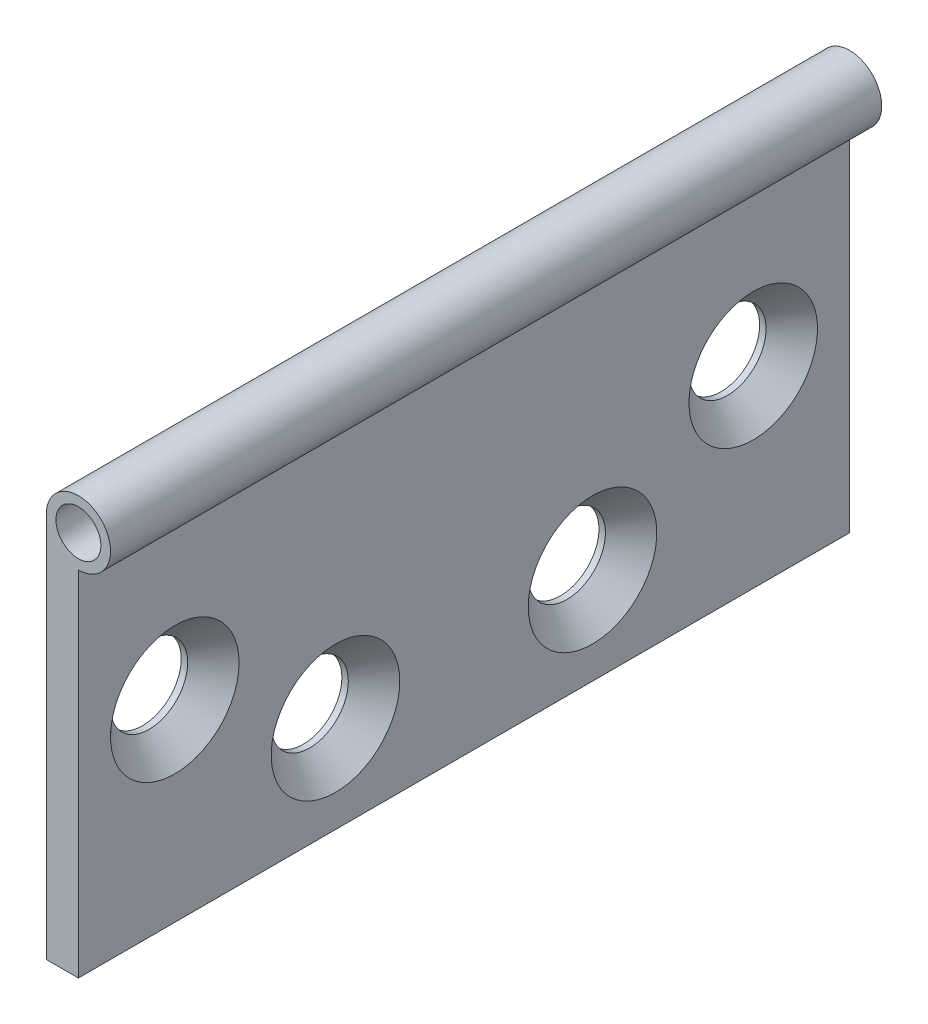
ISO-10303-21;
HEADER;
FILE_DESCRIPTION(('STEP AP214'),'2;1');
FILE_NAME('part.step','',(''),(''),'','','');
FILE_SCHEMA(('AUTOMOTIVE_DESIGN { 1 0 10303 214 1 1 1 1 }'));
ENDSEC;
DATA;
#1=APPLICATION_CONTEXT('core data for automotive mechanical design processes');
#2=APPLICATION_PROTOCOL_DEFINITION('international standard','automotive_design',2000,#1);
#3=PRODUCT_CONTEXT('',#1,'mechanical');
#4=PRODUCT('Part','Part','',(#3));
#5=PRODUCT_RELATED_PRODUCT_CATEGORY('part','',(#4));
#6=PRODUCT_DEFINITION_FORMATION('','',#4);
#7=PRODUCT_DEFINITION_CONTEXT('part definition',#1,'design');
#8=PRODUCT_DEFINITION('design','',#6,#7);
#9=PRODUCT_DEFINITION_SHAPE('','',#8);
#10=(LENGTH_UNIT() NAMED_UNIT(*) SI_UNIT(.MILLI.,.METRE.));
#11=(NAMED_UNIT(*) PLANE_ANGLE_UNIT() SI_UNIT($,.RADIAN.));
#12=(NAMED_UNIT(*) SI_UNIT($,.STERADIAN.) SOLID_ANGLE_UNIT());
#13=UNCERTAINTY_MEASURE_WITH_UNIT(LENGTH_MEASURE(1.E-05),#10,'distance_accuracy_value','');
#14=(GEOMETRIC_REPRESENTATION_CONTEXT(3) GLOBAL_UNCERTAINTY_ASSIGNED_CONTEXT((#13)) GLOBAL_UNIT_ASSIGNED_CONTEXT((#10,
#11,#12)) REPRESENTATION_CONTEXT('',''));
#15=CARTESIAN_POINT('',(0.,0.,0.));
#16=DIRECTION('',(0.,0.,1.));
#17=DIRECTION('',(1.,0.,0.));
#18=AXIS2_PLACEMENT_3D('',#15,#16,#17);
#19=CARTESIAN_POINT('',(5.,0.,60.));
#20=DIRECTION('',(-1.,0.,0.));
#21=DIRECTION('',(0.,0.,1.));
#22=AXIS2_PLACEMENT_3D('',#19,#20,#21);
#23=PLANE('',#22);
#24=CARTESIAN_POINT('',(5.,15.,-20.));
#25=DIRECTION('',(-1.,0.,0.));
#26=DIRECTION('',(0.,0.,1.));
#27=AXIS2_PLACEMENT_3D('',#24,#25,#26);
#28=CIRCLE('',#27,10.);
#29=CARTESIAN_POINT('',(5.,15.,-9.99999999999999));
#30=VERTEX_POINT('',#29);
#31=EDGE_CURVE('E127',#30,#30,#28,.T.);
#32=ORIENTED_EDGE('',*,*,#31,.T.);
#33=EDGE_LOOP('',(#32));
#34=FACE_BOUND('',#33,.T.);
#35=CARTESIAN_POINT('',(5.,30.,-45.));
#36=DIRECTION('',(-1.,0.,0.));
#37=DIRECTION('',(0.,0.,1.));
#38=AXIS2_PLACEMENT_3D('',#35,#36,#37);
#39=CIRCLE('',#38,10.);
#40=CARTESIAN_POINT('',(5.,30.,-35.));
#41=VERTEX_POINT('',#40);
#42=EDGE_CURVE('E131',#41,#41,#39,.T.);
#43=ORIENTED_EDGE('',*,*,#42,.T.);
#44=EDGE_LOOP('',(#43));
#45=FACE_BOUND('',#44,.T.);
#46=CARTESIAN_POINT('',(5.,30.,45.));
#47=DIRECTION('',(1.,0.,0.));
#48=DIRECTION('',(0.,0.,-1.));
#49=AXIS2_PLACEMENT_3D('',#46,#47,#48);
#50=CIRCLE('',#49,10.);
#51=CARTESIAN_POINT('',(5.,30.,35.));
#52=VERTEX_POINT('',#51);
#53=EDGE_CURVE('E135',#52,#52,#50,.T.);
#54=ORIENTED_EDGE('',*,*,#53,.F.);
#55=EDGE_LOOP('',(#54));
#56=FACE_BOUND('',#55,.T.);
#57=CARTESIAN_POINT('',(5.,15.,20.));
#58=DIRECTION('',(1.,0.,0.));
#59=DIRECTION('',(0.,0.,-1.));
#60=AXIS2_PLACEMENT_3D('',#57,#58,#59);
#61=CIRCLE('',#60,10.);
#62=CARTESIAN_POINT('',(5.,15.,9.99999999999999));
#63=VERTEX_POINT('',#62);
#64=EDGE_CURVE('E138',#63,#63,#61,.T.);
#65=ORIENTED_EDGE('',*,*,#64,.F.);
#66=EDGE_LOOP('',(#65));
#67=FACE_BOUND('',#66,.T.);
#68=DIRECTION('',(0.,0.,-1.));
#69=VECTOR('',#68,1.);
#70=CARTESIAN_POINT('',(5.,55.,60.));
#71=LINE('',#70,#69);
#72=CARTESIAN_POINT('',(5.,55.,60.));
#73=VERTEX_POINT('',#72);
#74=CARTESIAN_POINT('',(5.,55.,-60.));
#75=VERTEX_POINT('',#74);
#76=EDGE_CURVE('E51',#73,#75,#71,.T.);
#77=ORIENTED_EDGE('',*,*,#76,.F.);
#78=DIRECTION('',(0.,1.,0.));
#79=VECTOR('',#78,1.);
#80=CARTESIAN_POINT('',(5.,0.,60.));
#81=LINE('',#80,#79);
#82=CARTESIAN_POINT('',(5.,0.,60.));
#83=VERTEX_POINT('',#82);
#84=EDGE_CURVE('E106',#83,#73,#81,.T.);
#85=ORIENTED_EDGE('',*,*,#84,.F.);
#86=DIRECTION('',(0.,0.,-1.));
#87=VECTOR('',#86,1.);
#88=CARTESIAN_POINT('',(5.,0.,60.));
#89=LINE('',#88,#87);
#90=CARTESIAN_POINT('',(5.,0.,-60.));
#91=VERTEX_POINT('',#90);
#92=EDGE_CURVE('E60',#83,#91,#89,.T.);
#93=ORIENTED_EDGE('',*,*,#92,.T.);
#94=DIRECTION('',(0.,1.,0.));
#95=VECTOR('',#94,1.);
#96=CARTESIAN_POINT('',(5.,0.,-60.));
#97=LINE('',#96,#95);
#98=EDGE_CURVE('E101',#91,#75,#97,.T.);
#99=ORIENTED_EDGE('',*,*,#98,.T.);
#100=EDGE_LOOP('',(#77,#85,#93,#99));
#101=FACE_BOUND('',#100,.T.);
#102=ADVANCED_FACE('F37',(#34,#45,#56,#67,#101),#23,.F.);
#103=CARTESIAN_POINT('',(0.,0.,60.));
#104=DIRECTION('',(-1.,0.,0.));
#105=DIRECTION('',(0.,0.,1.));
#106=AXIS2_PLACEMENT_3D('',#103,#104,#105);
#107=PLANE('',#106);
#108=CARTESIAN_POINT('',(0.,15.,-20.));
#109=DIRECTION('',(-1.,0.,0.));
#110=DIRECTION('',(0.,0.,1.));
#111=AXIS2_PLACEMENT_3D('',#108,#109,#110);
#112=CIRCLE('',#111,6.);
#113=CARTESIAN_POINT('',(0.,15.,-14.));
#114=VERTEX_POINT('',#113);
#115=EDGE_CURVE('E218',#114,#114,#112,.T.);
#116=ORIENTED_EDGE('',*,*,#115,.F.);
#117=EDGE_LOOP('',(#116));
#118=FACE_BOUND('',#117,.T.);
#119=CARTESIAN_POINT('',(0.,30.,-45.));
#120=DIRECTION('',(-1.,0.,0.));
#121=DIRECTION('',(0.,0.,1.));
#122=AXIS2_PLACEMENT_3D('',#119,#120,#121);
#123=CIRCLE('',#122,6.);
#124=CARTESIAN_POINT('',(0.,30.,-39.));
#125=VERTEX_POINT('',#124);
#126=EDGE_CURVE('E225',#125,#125,#123,.T.);
#127=ORIENTED_EDGE('',*,*,#126,.F.);
#128=EDGE_LOOP('',(#127));
#129=FACE_BOUND('',#128,.T.);
#130=CARTESIAN_POINT('',(0.,30.,45.));
#131=DIRECTION('',(1.,0.,0.));
#132=DIRECTION('',(0.,0.,-1.));
#133=AXIS2_PLACEMENT_3D('',#130,#131,#132);
#134=CIRCLE('',#133,6.);
#135=CARTESIAN_POINT('',(0.,30.,39.));
#136=VERTEX_POINT('',#135);
#137=EDGE_CURVE('E141',#136,#136,#134,.T.);
#138=ORIENTED_EDGE('',*,*,#137,.T.);
#139=EDGE_LOOP('',(#138));
#140=FACE_BOUND('',#139,.T.);
#141=CARTESIAN_POINT('',(0.,15.,20.));
#142=DIRECTION('',(1.,0.,0.));
#143=DIRECTION('',(0.,0.,-1.));
#144=AXIS2_PLACEMENT_3D('',#141,#142,#143);
#145=CIRCLE('',#144,6.);
#146=CARTESIAN_POINT('',(0.,15.,14.));
#147=VERTEX_POINT('',#146);
#148=EDGE_CURVE('E144',#147,#147,#145,.T.);
#149=ORIENTED_EDGE('',*,*,#148,.T.);
#150=EDGE_LOOP('',(#149));
#151=FACE_BOUND('',#150,.T.);
#152=DIRECTION('',(0.,1.,0.));
#153=VECTOR('',#152,1.);
#154=CARTESIAN_POINT('',(0.,0.,-60.));
#155=LINE('',#154,#153);
#156=CARTESIAN_POINT('',(0.,0.,-60.));
#157=VERTEX_POINT('',#156);
#158=CARTESIAN_POINT('',(0.,60.,-60.));
#159=VERTEX_POINT('',#158);
#160=EDGE_CURVE('E100',#157,#159,#155,.T.);
#161=ORIENTED_EDGE('',*,*,#160,.F.);
#162=DIRECTION('',(0.,0.,-1.));
#163=VECTOR('',#162,1.);
#164=CARTESIAN_POINT('',(0.,0.,60.));
#165=LINE('',#164,#163);
#166=CARTESIAN_POINT('',(0.,0.,60.));
#167=VERTEX_POINT('',#166);
#168=EDGE_CURVE('E44',#167,#157,#165,.T.);
#169=ORIENTED_EDGE('',*,*,#168,.F.);
#170=DIRECTION('',(0.,1.,0.));
#171=VECTOR('',#170,1.);
#172=CARTESIAN_POINT('',(0.,0.,60.));
#173=LINE('',#172,#171);
#174=CARTESIAN_POINT('',(0.,60.,60.));
#175=VERTEX_POINT('',#174);
#176=EDGE_CURVE('E76',#167,#175,#173,.T.);
#177=ORIENTED_EDGE('',*,*,#176,.T.);
#178=DIRECTION('',(0.,0.,-1.));
#179=VECTOR('',#178,1.);
#180=CARTESIAN_POINT('',(0.,60.,60.));
#181=LINE('',#180,#179);
#182=EDGE_CURVE('E11',#175,#159,#181,.T.);
#183=ORIENTED_EDGE('',*,*,#182,.T.);
#184=EDGE_LOOP('',(#161,#169,#177,#183));
#185=FACE_BOUND('',#184,.T.);
#186=ADVANCED_FACE('F117',(#118,#129,#140,#151,#185),#107,.T.);
#187=CARTESIAN_POINT('',(5.,0.,60.));
#188=DIRECTION('',(0.,-1.,0.));
#189=DIRECTION('',(0.,0.,-1.));
#190=AXIS2_PLACEMENT_3D('',#187,#188,#189);
#191=PLANE('',#190);
#192=DIRECTION('',(-1.,0.,0.));
#193=VECTOR('',#192,1.);
#194=CARTESIAN_POINT('',(5.,0.,-60.));
#195=LINE('',#194,#193);
#196=EDGE_CURVE('E108',#91,#157,#195,.T.);
#197=ORIENTED_EDGE('',*,*,#196,.F.);
#198=ORIENTED_EDGE('',*,*,#92,.F.);
#199=DIRECTION('',(-1.,0.,0.));
#200=VECTOR('',#199,1.);
#201=CARTESIAN_POINT('',(5.,0.,60.));
#202=LINE('',#201,#200);
#203=EDGE_CURVE('E110',#83,#167,#202,.T.);
#204=ORIENTED_EDGE('',*,*,#203,.T.);
#205=ORIENTED_EDGE('',*,*,#168,.T.);
#206=EDGE_LOOP('',(#197,#198,#204,#205));
#207=FACE_BOUND('',#206,.T.);
#208=ADVANCED_FACE('F115',(#207),#191,.T.);
#209=CARTESIAN_POINT('',(0.,0.,60.));
#210=DIRECTION('',(0.,0.,-1.));
#211=DIRECTION('',(-1.,0.,0.));
#212=AXIS2_PLACEMENT_3D('',#209,#210,#211);
#213=PLANE('',#212);
#214=CARTESIAN_POINT('',(5.,60.,60.));
#215=DIRECTION('',(0.,0.,1.));
#216=DIRECTION('',(1.,0.,0.));
#217=AXIS2_PLACEMENT_3D('',#214,#215,#216);
#218=CIRCLE('',#217,3.5);
#219=CARTESIAN_POINT('',(8.5,60.,60.));
#220=VERTEX_POINT('',#219);
#221=EDGE_CURVE('E153',#220,#220,#218,.T.);
#222=ORIENTED_EDGE('',*,*,#221,.F.);
#223=EDGE_LOOP('',(#222));
#224=FACE_BOUND('',#223,.T.);
#225=ORIENTED_EDGE('',*,*,#84,.T.);
#226=CARTESIAN_POINT('',(5.,60.,60.));
#227=DIRECTION('',(0.,0.,1.));
#228=DIRECTION('',(1.,0.,0.));
#229=AXIS2_PLACEMENT_3D('',#226,#227,#228);
#230=CIRCLE('',#229,5.);
#231=CARTESIAN_POINT('',(10.,60.,60.));
#232=VERTEX_POINT('',#231);
#233=EDGE_CURVE('E156',#73,#232,#230,.T.);
#234=ORIENTED_EDGE('',*,*,#233,.T.);
#235=EDGE_CURVE('E94',#232,#175,#230,.T.);
#236=ORIENTED_EDGE('',*,*,#235,.T.);
#237=ORIENTED_EDGE('',*,*,#176,.F.);
#238=ORIENTED_EDGE('',*,*,#203,.F.);
#239=EDGE_LOOP('',(#225,#234,#236,#237,#238));
#240=FACE_BOUND('',#239,.T.);
#241=ADVANCED_FACE('F162',(#224,#240),#213,.F.);
#242=CARTESIAN_POINT('',(0.,0.,-60.));
#243=DIRECTION('',(0.,0.,-1.));
#244=DIRECTION('',(-1.,0.,0.));
#245=AXIS2_PLACEMENT_3D('',#242,#243,#244);
#246=PLANE('',#245);
#247=CARTESIAN_POINT('',(5.,60.,-60.));
#248=DIRECTION('',(0.,0.,1.));
#249=DIRECTION('',(1.,0.,0.));
#250=AXIS2_PLACEMENT_3D('',#247,#248,#249);
#251=CIRCLE('',#250,3.5);
#252=CARTESIAN_POINT('',(8.5,60.,-60.));
#253=VERTEX_POINT('',#252);
#254=EDGE_CURVE('E154',#253,#253,#251,.T.);
#255=ORIENTED_EDGE('',*,*,#254,.T.);
#256=EDGE_LOOP('',(#255));
#257=FACE_BOUND('',#256,.T.);
#258=ORIENTED_EDGE('',*,*,#160,.T.);
#259=CARTESIAN_POINT('',(5.,60.,-60.));
#260=DIRECTION('',(0.,0.,1.));
#261=DIRECTION('',(1.,0.,0.));
#262=AXIS2_PLACEMENT_3D('',#259,#260,#261);
#263=CIRCLE('',#262,5.);
#264=CARTESIAN_POINT('',(10.,60.,-60.));
#265=VERTEX_POINT('',#264);
#266=EDGE_CURVE('E91',#265,#159,#263,.T.);
#267=ORIENTED_EDGE('',*,*,#266,.F.);
#268=EDGE_CURVE('E88',#75,#265,#263,.T.);
#269=ORIENTED_EDGE('',*,*,#268,.F.);
#270=ORIENTED_EDGE('',*,*,#98,.F.);
#271=ORIENTED_EDGE('',*,*,#196,.T.);
#272=EDGE_LOOP('',(#258,#267,#269,#270,#271));
#273=FACE_BOUND('',#272,.T.);
#274=ADVANCED_FACE('F97',(#257,#273),#246,.T.);
#275=CARTESIAN_POINT('',(5.,60.,60.));
#276=DIRECTION('',(0.,0.,-1.));
#277=DIRECTION('',(-1.,0.,0.));
#278=AXIS2_PLACEMENT_3D('',#275,#276,#277);
#279=CYLINDRICAL_SURFACE('',#278,5.);
#280=ORIENTED_EDGE('',*,*,#182,.F.);
#281=ORIENTED_EDGE('',*,*,#235,.F.);
#282=ORIENTED_EDGE('',*,*,#233,.F.);
#283=ORIENTED_EDGE('',*,*,#76,.T.);
#284=ORIENTED_EDGE('',*,*,#268,.T.);
#285=ORIENTED_EDGE('',*,*,#266,.T.);
#286=EDGE_LOOP('',(#280,#281,#282,#283,#284,#285));
#287=FACE_BOUND('',#286,.T.);
#288=ADVANCED_FACE('F90',(#287),#279,.T.);
#289=CARTESIAN_POINT('',(5.,60.,-60.));
#290=DIRECTION('',(0.,0.,1.));
#291=DIRECTION('',(1.,0.,0.));
#292=AXIS2_PLACEMENT_3D('',#289,#290,#291);
#293=CYLINDRICAL_SURFACE('',#292,3.5);
#294=ORIENTED_EDGE('',*,*,#254,.F.);
#295=EDGE_LOOP('',(#294));
#296=FACE_BOUND('',#295,.T.);
#297=ORIENTED_EDGE('',*,*,#221,.T.);
#298=EDGE_LOOP('',(#297));
#299=FACE_BOUND('',#298,.T.);
#300=ADVANCED_FACE('F160',(#296,#299),#293,.F.);
#301=CARTESIAN_POINT('',(5.,15.,20.));
#302=DIRECTION('',(1.,0.,0.));
#303=DIRECTION('',(0.,0.,-1.));
#304=AXIS2_PLACEMENT_3D('',#301,#302,#303);
#305=CYLINDRICAL_SURFACE('',#304,6.);
#306=ORIENTED_EDGE('',*,*,#148,.F.);
#307=EDGE_LOOP('',(#306));
#308=FACE_BOUND('',#307,.T.);
#309=CARTESIAN_POINT('',(1.,15.,20.));
#310=DIRECTION('',(1.,0.,0.));
#311=DIRECTION('',(0.,0.,-1.));
#312=AXIS2_PLACEMENT_3D('',#309,#310,#311);
#313=CIRCLE('',#312,6.);
#314=CARTESIAN_POINT('',(1.,15.,14.));
#315=VERTEX_POINT('',#314);
#316=EDGE_CURVE('E140',#315,#315,#313,.T.);
#317=ORIENTED_EDGE('',*,*,#316,.T.);
#318=EDGE_LOOP('',(#317));
#319=FACE_BOUND('',#318,.T.);
#320=ADVANCED_FACE('F180',(#308,#319),#305,.F.);
#321=CARTESIAN_POINT('',(5.,15.,20.));
#322=DIRECTION('',(1.,0.,0.));
#323=DIRECTION('',(0.,0.,-1.));
#324=AXIS2_PLACEMENT_3D('',#321,#322,#323);
#325=CONICAL_SURFACE('',#324,10.,0.785398163397449);
#326=ORIENTED_EDGE('',*,*,#316,.F.);
#327=EDGE_LOOP('',(#326));
#328=FACE_BOUND('',#327,.T.);
#329=ORIENTED_EDGE('',*,*,#64,.T.);
#330=EDGE_LOOP('',(#329));
#331=FACE_BOUND('',#330,.T.);
#332=ADVANCED_FACE('F184',(#328,#331),#325,.F.);
#333=CARTESIAN_POINT('',(5.,30.,45.));
#334=DIRECTION('',(1.,0.,0.));
#335=DIRECTION('',(0.,0.,-1.));
#336=AXIS2_PLACEMENT_3D('',#333,#334,#335);
#337=CYLINDRICAL_SURFACE('',#336,6.);
#338=ORIENTED_EDGE('',*,*,#137,.F.);
#339=EDGE_LOOP('',(#338));
#340=FACE_BOUND('',#339,.T.);
#341=CARTESIAN_POINT('',(1.,30.,45.));
#342=DIRECTION('',(1.,0.,0.));
#343=DIRECTION('',(0.,0.,-1.));
#344=AXIS2_PLACEMENT_3D('',#341,#342,#343);
#345=CIRCLE('',#344,6.);
#346=CARTESIAN_POINT('',(1.,30.,39.));
#347=VERTEX_POINT('',#346);
#348=EDGE_CURVE('E147',#347,#347,#345,.T.);
#349=ORIENTED_EDGE('',*,*,#348,.T.);
#350=EDGE_LOOP('',(#349));
#351=FACE_BOUND('',#350,.T.);
#352=ADVANCED_FACE('F188',(#340,#351),#337,.F.);
#353=CARTESIAN_POINT('',(5.,30.,45.));
#354=DIRECTION('',(1.,0.,0.));
#355=DIRECTION('',(0.,0.,-1.));
#356=AXIS2_PLACEMENT_3D('',#353,#354,#355);
#357=CONICAL_SURFACE('',#356,10.,0.785398163397449);
#358=ORIENTED_EDGE('',*,*,#348,.F.);
#359=EDGE_LOOP('',(#358));
#360=FACE_BOUND('',#359,.T.);
#361=ORIENTED_EDGE('',*,*,#53,.T.);
#362=EDGE_LOOP('',(#361));
#363=FACE_BOUND('',#362,.T.);
#364=ADVANCED_FACE('F192',(#360,#363),#357,.F.);
#365=CARTESIAN_POINT('',(5.,30.,-45.));
#366=DIRECTION('',(1.,0.,0.));
#367=DIRECTION('',(0.,0.,1.));
#368=AXIS2_PLACEMENT_3D('',#365,#366,#367);
#369=CYLINDRICAL_SURFACE('',#368,6.);
#370=ORIENTED_EDGE('',*,*,#126,.T.);
#371=EDGE_LOOP('',(#370));
#372=FACE_BOUND('',#371,.T.);
#373=CARTESIAN_POINT('',(1.,30.,-45.));
#374=DIRECTION('',(-1.,0.,0.));
#375=DIRECTION('',(0.,0.,1.));
#376=AXIS2_PLACEMENT_3D('',#373,#374,#375);
#377=CIRCLE('',#376,6.);
#378=CARTESIAN_POINT('',(1.,30.,-39.));
#379=VERTEX_POINT('',#378);
#380=EDGE_CURVE('E228',#379,#379,#377,.T.);
#381=ORIENTED_EDGE('',*,*,#380,.F.);
#382=EDGE_LOOP('',(#381));
#383=FACE_BOUND('',#382,.T.);
#384=ADVANCED_FACE('F196',(#372,#383),#369,.F.);
#385=CARTESIAN_POINT('',(5.,30.,-45.));
#386=DIRECTION('',(1.,0.,0.));
#387=DIRECTION('',(0.,0.,1.));
#388=AXIS2_PLACEMENT_3D('',#385,#386,#387);
#389=CONICAL_SURFACE('',#388,10.,0.785398163397449);
#390=ORIENTED_EDGE('',*,*,#380,.T.);
#391=EDGE_LOOP('',(#390));
#392=FACE_BOUND('',#391,.T.);
#393=ORIENTED_EDGE('',*,*,#42,.F.);
#394=EDGE_LOOP('',(#393));
#395=FACE_BOUND('',#394,.T.);
#396=ADVANCED_FACE('F200',(#392,#395),#389,.F.);
#397=CARTESIAN_POINT('',(5.,15.,-20.));
#398=DIRECTION('',(1.,0.,0.));
#399=DIRECTION('',(0.,0.,1.));
#400=AXIS2_PLACEMENT_3D('',#397,#398,#399);
#401=CYLINDRICAL_SURFACE('',#400,6.);
#402=ORIENTED_EDGE('',*,*,#115,.T.);
#403=EDGE_LOOP('',(#402));
#404=FACE_BOUND('',#403,.T.);
#405=CARTESIAN_POINT('',(1.,15.,-20.));
#406=DIRECTION('',(-1.,0.,0.));
#407=DIRECTION('',(0.,0.,1.));
#408=AXIS2_PLACEMENT_3D('',#405,#406,#407);
#409=CIRCLE('',#408,6.);
#410=CARTESIAN_POINT('',(1.,15.,-14.));
#411=VERTEX_POINT('',#410);
#412=EDGE_CURVE('E217',#411,#411,#409,.T.);
#413=ORIENTED_EDGE('',*,*,#412,.F.);
#414=EDGE_LOOP('',(#413));
#415=FACE_BOUND('',#414,.T.);
#416=ADVANCED_FACE('F204',(#404,#415),#401,.F.);
#417=CARTESIAN_POINT('',(5.,15.,-20.));
#418=DIRECTION('',(1.,0.,0.));
#419=DIRECTION('',(0.,0.,1.));
#420=AXIS2_PLACEMENT_3D('',#417,#418,#419);
#421=CONICAL_SURFACE('',#420,10.,0.785398163397449);
#422=ORIENTED_EDGE('',*,*,#412,.T.);
#423=EDGE_LOOP('',(#422));
#424=FACE_BOUND('',#423,.T.);
#425=ORIENTED_EDGE('',*,*,#31,.F.);
#426=EDGE_LOOP('',(#425));
#427=FACE_BOUND('',#426,.T.);
#428=ADVANCED_FACE('F208',(#424,#427),#421,.F.);
#429=CLOSED_SHELL('',(#102,#186,#208,#241,#274,#288,#300,#320,#332,#352,#364,#384,#396,#416,#428));
#430=MANIFOLD_SOLID_BREP('B2',#429);
#431=ADVANCED_BREP_SHAPE_REPRESENTATION('',(#18,#430),#14);
#432=SHAPE_DEFINITION_REPRESENTATION(#9,#431);
ENDSEC;
END-ISO-10303-21;
